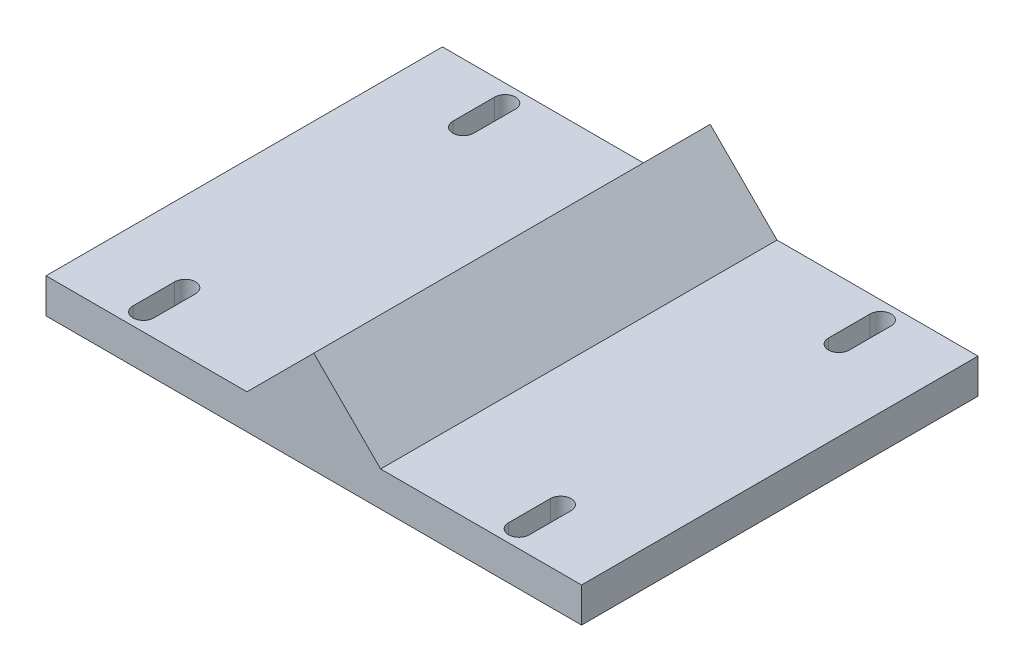
ISO-10303-21;
HEADER;
FILE_DESCRIPTION(('STEP AP214'),'2;1');
FILE_NAME('part.step','',(''),(''),'','','');
FILE_SCHEMA(('AUTOMOTIVE_DESIGN { 1 0 10303 214 1 1 1 1 }'));
ENDSEC;
DATA;
#1=APPLICATION_CONTEXT('core data for automotive mechanical design processes');
#2=APPLICATION_PROTOCOL_DEFINITION('international standard','automotive_design',2000,#1);
#3=PRODUCT_CONTEXT('',#1,'mechanical');
#4=PRODUCT('Part','Part','',(#3));
#5=PRODUCT_RELATED_PRODUCT_CATEGORY('part','',(#4));
#6=PRODUCT_DEFINITION_FORMATION('','',#4);
#7=PRODUCT_DEFINITION_CONTEXT('part definition',#1,'design');
#8=PRODUCT_DEFINITION('design','',#6,#7);
#9=PRODUCT_DEFINITION_SHAPE('','',#8);
#10=(LENGTH_UNIT() NAMED_UNIT(*) SI_UNIT(.MILLI.,.METRE.));
#11=(NAMED_UNIT(*) PLANE_ANGLE_UNIT() SI_UNIT($,.RADIAN.));
#12=(NAMED_UNIT(*) SI_UNIT($,.STERADIAN.) SOLID_ANGLE_UNIT());
#13=UNCERTAINTY_MEASURE_WITH_UNIT(LENGTH_MEASURE(1.E-05),#10,'distance_accuracy_value','');
#14=(GEOMETRIC_REPRESENTATION_CONTEXT(3) GLOBAL_UNCERTAINTY_ASSIGNED_CONTEXT((#13)) GLOBAL_UNIT_ASSIGNED_CONTEXT((#10,
#11,#12)) REPRESENTATION_CONTEXT('',''));
#15=CARTESIAN_POINT('',(0.,0.,0.));
#16=DIRECTION('',(0.,0.,1.));
#17=DIRECTION('',(1.,0.,0.));
#18=AXIS2_PLACEMENT_3D('',#15,#16,#17);
#19=CARTESIAN_POINT('',(7.53999999999993,-7.54,57.));
#20=DIRECTION('',(0.707106781186551,0.707106781186544,0.));
#21=DIRECTION('',(-0.707106781186544,0.707106781186551,0.));
#22=AXIS2_PLACEMENT_3D('',#19,#20,#21);
#23=PLANE('',#22);
#24=DIRECTION('',(0.,0.,-1.));
#25=VECTOR('',#24,1.);
#26=CARTESIAN_POINT('',(7.53999999999993,-7.54,57.));
#27=LINE('',#26,#25);
#28=CARTESIAN_POINT('',(7.53999999999993,-7.54,42.7));
#29=VERTEX_POINT('',#28);
#30=CARTESIAN_POINT('',(7.53999999999993,-7.54,0.));
#31=VERTEX_POINT('',#30);
#32=EDGE_CURVE('E367',#29,#31,#27,.T.);
#33=ORIENTED_EDGE('',*,*,#32,.F.);
#34=DIRECTION('',(-0.707106781186544,0.707106781186551,0.));
#35=VECTOR('',#34,1.);
#36=CARTESIAN_POINT('',(0.,0.,42.7));
#37=LINE('',#36,#35);
#38=CARTESIAN_POINT('',(0.,0.,42.7));
#39=VERTEX_POINT('',#38);
#40=EDGE_CURVE('E298',#29,#39,#37,.T.);
#41=ORIENTED_EDGE('',*,*,#40,.T.);
#42=DIRECTION('',(0.,0.,-1.));
#43=VECTOR('',#42,1.);
#44=CARTESIAN_POINT('',(0.,0.,57.));
#45=LINE('',#44,#43);
#46=CARTESIAN_POINT('',(0.,0.,0.));
#47=VERTEX_POINT('',#46);
#48=EDGE_CURVE('E321',#39,#47,#45,.T.);
#49=ORIENTED_EDGE('',*,*,#48,.T.);
#50=DIRECTION('',(0.707106781186544,-0.707106781186551,0.));
#51=VECTOR('',#50,1.);
#52=CARTESIAN_POINT('',(7.53999999999993,-7.54,0.));
#53=LINE('',#52,#51);
#54=EDGE_CURVE('E304',#47,#31,#53,.T.);
#55=ORIENTED_EDGE('',*,*,#54,.T.);
#56=EDGE_LOOP('',(#33,#41,#49,#55));
#57=FACE_BOUND('',#56,.T.);
#58=ADVANCED_FACE('F37',(#57),#23,.F.);
#59=CARTESIAN_POINT('',(38.4999999999999,-2.54,57.));
#60=DIRECTION('',(-1.,0.,0.));
#61=DIRECTION('',(0.,-1.,0.));
#62=AXIS2_PLACEMENT_3D('',#59,#60,#61);
#63=PLANE('',#62);
#64=DIRECTION('',(0.,1.,0.));
#65=VECTOR('',#64,1.);
#66=CARTESIAN_POINT('',(38.4999999999999,-2.54,0.));
#67=LINE('',#66,#65);
#68=CARTESIAN_POINT('',(38.4999999999999,-7.54,0.));
#69=VERTEX_POINT('',#68);
#70=CARTESIAN_POINT('',(38.4999999999999,-2.54,0.));
#71=VERTEX_POINT('',#70);
#72=EDGE_CURVE('E326',#69,#71,#67,.T.);
#73=ORIENTED_EDGE('',*,*,#72,.T.);
#74=DIRECTION('',(0.,0.,-1.));
#75=VECTOR('',#74,1.);
#76=CARTESIAN_POINT('',(38.4999999999999,-2.54,57.));
#77=LINE('',#76,#75);
#78=CARTESIAN_POINT('',(38.4999999999999,-2.54,57.));
#79=VERTEX_POINT('',#78);
#80=EDGE_CURVE('E361',#79,#71,#77,.T.);
#81=ORIENTED_EDGE('',*,*,#80,.F.);
#82=DIRECTION('',(0.,1.,0.));
#83=VECTOR('',#82,1.);
#84=CARTESIAN_POINT('',(38.4999999999999,-2.54,57.));
#85=LINE('',#84,#83);
#86=CARTESIAN_POINT('',(38.4999999999999,-7.54,57.));
#87=VERTEX_POINT('',#86);
#88=EDGE_CURVE('E307',#87,#79,#85,.T.);
#89=ORIENTED_EDGE('',*,*,#88,.F.);
#90=DIRECTION('',(0.,0.,-1.));
#91=VECTOR('',#90,1.);
#92=CARTESIAN_POINT('',(38.4999999999999,-7.54,57.));
#93=LINE('',#92,#91);
#94=EDGE_CURVE('E364',#87,#69,#93,.T.);
#95=ORIENTED_EDGE('',*,*,#94,.T.);
#96=EDGE_LOOP('',(#73,#81,#89,#95));
#97=FACE_BOUND('',#96,.T.);
#98=ADVANCED_FACE('F427',(#97),#63,.F.);
#99=CARTESIAN_POINT('',(9.61106781186541,-2.54,57.));
#100=DIRECTION('',(0.,-1.,0.));
#101=DIRECTION('',(0.,0.,-1.));
#102=AXIS2_PLACEMENT_3D('',#99,#100,#101);
#103=PLANE('',#102);
#104=DIRECTION('',(0.,0.,1.));
#105=VECTOR('',#104,1.);
#106=CARTESIAN_POINT('',(25.4996846506127,-2.54,48.5));
#107=LINE('',#106,#105);
#108=CARTESIAN_POINT('',(25.4996846506127,-2.54,48.5));
#109=VERTEX_POINT('',#108);
#110=CARTESIAN_POINT('',(25.4996846506127,-2.54,54.5));
#111=VERTEX_POINT('',#110);
#112=EDGE_CURVE('E274',#109,#111,#107,.T.);
#113=ORIENTED_EDGE('',*,*,#112,.F.);
#114=CARTESIAN_POINT('',(26.9999999999999,-2.54,48.5));
#115=DIRECTION('',(0.,1.,0.));
#116=DIRECTION('',(0.,0.,1.));
#117=AXIS2_PLACEMENT_3D('',#114,#115,#116);
#118=CIRCLE('',#117,1.50031534938726);
#119=CARTESIAN_POINT('',(28.5003153493872,-2.54,48.5));
#120=VERTEX_POINT('',#119);
#121=EDGE_CURVE('E51',#120,#109,#118,.T.);
#122=ORIENTED_EDGE('',*,*,#121,.F.);
#123=DIRECTION('',(0.,0.,1.));
#124=VECTOR('',#123,1.);
#125=CARTESIAN_POINT('',(28.5003153493872,-2.54,48.5));
#126=LINE('',#125,#124);
#127=CARTESIAN_POINT('',(28.5003153493872,-2.54,54.5));
#128=VERTEX_POINT('',#127);
#129=EDGE_CURVE('E262',#120,#128,#126,.T.);
#130=ORIENTED_EDGE('',*,*,#129,.T.);
#131=CARTESIAN_POINT('',(26.9999999999999,-2.54,54.5));
#132=DIRECTION('',(0.,1.,0.));
#133=DIRECTION('',(0.,0.,1.));
#134=AXIS2_PLACEMENT_3D('',#131,#132,#133);
#135=CIRCLE('',#134,1.50031534938726);
#136=EDGE_CURVE('E271',#111,#128,#135,.T.);
#137=ORIENTED_EDGE('',*,*,#136,.F.);
#138=EDGE_LOOP('',(#113,#122,#130,#137));
#139=FACE_BOUND('',#138,.T.);
#140=CARTESIAN_POINT('',(26.9999999999999,-2.54,8.5));
#141=DIRECTION('',(0.,1.,0.));
#142=DIRECTION('',(0.,0.,1.));
#143=AXIS2_PLACEMENT_3D('',#140,#141,#142);
#144=CIRCLE('',#143,1.50031534938727);
#145=CARTESIAN_POINT('',(25.4996846506127,-2.54,8.5));
#146=VERTEX_POINT('',#145);
#147=CARTESIAN_POINT('',(28.5003153493872,-2.54,8.5));
#148=VERTEX_POINT('',#147);
#149=EDGE_CURVE('E233',#146,#148,#144,.T.);
#150=ORIENTED_EDGE('',*,*,#149,.F.);
#151=DIRECTION('',(0.,0.,1.));
#152=VECTOR('',#151,1.);
#153=CARTESIAN_POINT('',(25.4996846506127,-2.54,0.));
#154=LINE('',#153,#152);
#155=CARTESIAN_POINT('',(25.4996846506127,-2.54,2.5));
#156=VERTEX_POINT('',#155);
#157=EDGE_CURVE('E59',#156,#146,#154,.T.);
#158=ORIENTED_EDGE('',*,*,#157,.F.);
#159=CARTESIAN_POINT('',(26.9999999999999,-2.54,2.5));
#160=DIRECTION('',(0.,1.,0.));
#161=DIRECTION('',(0.,0.,1.));
#162=AXIS2_PLACEMENT_3D('',#159,#160,#161);
#163=CIRCLE('',#162,1.50031534938727);
#164=CARTESIAN_POINT('',(28.5003153493872,-2.54,2.5));
#165=VERTEX_POINT('',#164);
#166=EDGE_CURVE('E220',#165,#156,#163,.T.);
#167=ORIENTED_EDGE('',*,*,#166,.F.);
#168=DIRECTION('',(0.,0.,1.));
#169=VECTOR('',#168,1.);
#170=CARTESIAN_POINT('',(28.5003153493872,-2.54,0.));
#171=LINE('',#170,#169);
#172=EDGE_CURVE('E226',#165,#148,#171,.T.);
#173=ORIENTED_EDGE('',*,*,#172,.T.);
#174=EDGE_LOOP('',(#150,#158,#167,#173));
#175=FACE_BOUND('',#174,.T.);
#176=DIRECTION('',(-1.,0.,0.));
#177=VECTOR('',#176,1.);
#178=CARTESIAN_POINT('',(9.61106781186541,-2.54,0.));
#179=LINE('',#178,#177);
#180=CARTESIAN_POINT('',(9.61106781186541,-2.54,0.));
#181=VERTEX_POINT('',#180);
#182=EDGE_CURVE('E328',#71,#181,#179,.T.);
#183=ORIENTED_EDGE('',*,*,#182,.T.);
#184=DIRECTION('',(0.,0.,-1.));
#185=VECTOR('',#184,1.);
#186=CARTESIAN_POINT('',(9.61106781186541,-2.54,57.));
#187=LINE('',#186,#185);
#188=CARTESIAN_POINT('',(9.61106781186541,-2.54,57.));
#189=VERTEX_POINT('',#188);
#190=EDGE_CURVE('E358',#189,#181,#187,.T.);
#191=ORIENTED_EDGE('',*,*,#190,.F.);
#192=DIRECTION('',(-1.,0.,0.));
#193=VECTOR('',#192,1.);
#194=CARTESIAN_POINT('',(9.61106781186541,-2.54,57.));
#195=LINE('',#194,#193);
#196=EDGE_CURVE('E310',#79,#189,#195,.T.);
#197=ORIENTED_EDGE('',*,*,#196,.F.);
#198=ORIENTED_EDGE('',*,*,#80,.T.);
#199=EDGE_LOOP('',(#183,#191,#197,#198));
#200=FACE_BOUND('',#199,.T.);
#201=ADVANCED_FACE('F230',(#139,#175,#200),#103,.F.);
#202=CARTESIAN_POINT('',(0.,7.07106781186549,57.));
#203=DIRECTION('',(-0.707106781186551,-0.707106781186544,0.));
#204=DIRECTION('',(0.707106781186544,-0.707106781186551,0.));
#205=AXIS2_PLACEMENT_3D('',#202,#203,#204);
#206=PLANE('',#205);
#207=DIRECTION('',(-0.707106781186544,0.707106781186551,0.));
#208=VECTOR('',#207,1.);
#209=CARTESIAN_POINT('',(0.,7.07106781186549,0.));
#210=LINE('',#209,#208);
#211=CARTESIAN_POINT('',(0.,7.07106781186549,0.));
#212=VERTEX_POINT('',#211);
#213=EDGE_CURVE('E330',#181,#212,#210,.T.);
#214=ORIENTED_EDGE('',*,*,#213,.T.);
#215=DIRECTION('',(0.,0.,-1.));
#216=VECTOR('',#215,1.);
#217=CARTESIAN_POINT('',(0.,7.07106781186549,57.));
#218=LINE('',#217,#216);
#219=CARTESIAN_POINT('',(0.,7.07106781186549,57.));
#220=VERTEX_POINT('',#219);
#221=EDGE_CURVE('E355',#220,#212,#218,.T.);
#222=ORIENTED_EDGE('',*,*,#221,.F.);
#223=DIRECTION('',(-0.707106781186544,0.707106781186551,0.));
#224=VECTOR('',#223,1.);
#225=CARTESIAN_POINT('',(0.,7.07106781186549,57.));
#226=LINE('',#225,#224);
#227=EDGE_CURVE('E312',#189,#220,#226,.T.);
#228=ORIENTED_EDGE('',*,*,#227,.F.);
#229=ORIENTED_EDGE('',*,*,#190,.T.);
#230=EDGE_LOOP('',(#214,#222,#228,#229));
#231=FACE_BOUND('',#230,.T.);
#232=ADVANCED_FACE('F426',(#231),#206,.F.);
#233=CARTESIAN_POINT('',(-9.6110678118655,-2.54000000000001,57.));
#234=DIRECTION('',(0.707106781186546,-0.707106781186549,0.));
#235=DIRECTION('',(0.707106781186549,0.707106781186546,0.));
#236=AXIS2_PLACEMENT_3D('',#233,#234,#235);
#237=PLANE('',#236);
#238=DIRECTION('',(-0.707106781186549,-0.707106781186546,0.));
#239=VECTOR('',#238,1.);
#240=CARTESIAN_POINT('',(-9.6110678118655,-2.54000000000001,0.));
#241=LINE('',#240,#239);
#242=CARTESIAN_POINT('',(-9.6110678118655,-2.54000000000001,0.));
#243=VERTEX_POINT('',#242);
#244=EDGE_CURVE('E332',#212,#243,#241,.T.);
#245=ORIENTED_EDGE('',*,*,#244,.T.);
#246=DIRECTION('',(0.,0.,-1.));
#247=VECTOR('',#246,1.);
#248=CARTESIAN_POINT('',(-9.6110678118655,-2.54000000000001,57.));
#249=LINE('',#248,#247);
#250=CARTESIAN_POINT('',(-9.6110678118655,-2.54000000000001,57.));
#251=VERTEX_POINT('',#250);
#252=EDGE_CURVE('E352',#251,#243,#249,.T.);
#253=ORIENTED_EDGE('',*,*,#252,.F.);
#254=DIRECTION('',(-0.707106781186549,-0.707106781186546,0.));
#255=VECTOR('',#254,1.);
#256=CARTESIAN_POINT('',(-9.6110678118655,-2.54000000000001,57.));
#257=LINE('',#256,#255);
#258=EDGE_CURVE('E314',#220,#251,#257,.T.);
#259=ORIENTED_EDGE('',*,*,#258,.F.);
#260=ORIENTED_EDGE('',*,*,#221,.T.);
#261=EDGE_LOOP('',(#245,#253,#259,#260));
#262=FACE_BOUND('',#261,.T.);
#263=ADVANCED_FACE('F434',(#262),#237,.F.);
#264=CARTESIAN_POINT('',(-38.5,-2.54,57.));
#265=DIRECTION('',(0.,-1.,0.));
#266=DIRECTION('',(1.,0.,0.));
#267=AXIS2_PLACEMENT_3D('',#264,#265,#266);
#268=PLANE('',#267);
#269=CARTESIAN_POINT('',(-27.,-2.54,8.5));
#270=DIRECTION('',(0.,1.,0.));
#271=DIRECTION('',(0.,0.,1.));
#272=AXIS2_PLACEMENT_3D('',#269,#270,#271);
#273=CIRCLE('',#272,1.50031534938726);
#274=CARTESIAN_POINT('',(-28.5003153493873,-2.54000000000001,8.5));
#275=VERTEX_POINT('',#274);
#276=CARTESIAN_POINT('',(-25.4996846506128,-2.54,8.5));
#277=VERTEX_POINT('',#276);
#278=EDGE_CURVE('E256',#275,#277,#273,.T.);
#279=ORIENTED_EDGE('',*,*,#278,.F.);
#280=DIRECTION('',(0.,0.,1.));
#281=VECTOR('',#280,1.);
#282=CARTESIAN_POINT('',(-28.5003153493873,-2.54,0.));
#283=LINE('',#282,#281);
#284=CARTESIAN_POINT('',(-28.5003153493873,-2.54,2.5));
#285=VERTEX_POINT('',#284);
#286=EDGE_CURVE('E217',#285,#275,#283,.T.);
#287=ORIENTED_EDGE('',*,*,#286,.F.);
#288=CARTESIAN_POINT('',(-27.,-2.54,2.5));
#289=DIRECTION('',(0.,1.,0.));
#290=DIRECTION('',(0.,0.,1.));
#291=AXIS2_PLACEMENT_3D('',#288,#289,#290);
#292=CIRCLE('',#291,1.50031534938726);
#293=CARTESIAN_POINT('',(-25.4996846506128,-2.54,2.5));
#294=VERTEX_POINT('',#293);
#295=EDGE_CURVE('E244',#294,#285,#292,.T.);
#296=ORIENTED_EDGE('',*,*,#295,.F.);
#297=DIRECTION('',(0.,0.,1.));
#298=VECTOR('',#297,1.);
#299=CARTESIAN_POINT('',(-25.4996846506128,-2.54,0.));
#300=LINE('',#299,#298);
#301=EDGE_CURVE('E253',#294,#277,#300,.T.);
#302=ORIENTED_EDGE('',*,*,#301,.T.);
#303=EDGE_LOOP('',(#279,#287,#296,#302));
#304=FACE_BOUND('',#303,.T.);
#305=CARTESIAN_POINT('',(-27.,-2.54,54.5));
#306=DIRECTION('',(0.,1.,0.));
#307=DIRECTION('',(0.,0.,1.));
#308=AXIS2_PLACEMENT_3D('',#305,#306,#307);
#309=CIRCLE('',#308,1.50031534938726);
#310=CARTESIAN_POINT('',(-28.5003153493873,-2.54000000000001,54.5));
#311=VERTEX_POINT('',#310);
#312=CARTESIAN_POINT('',(-25.4996846506128,-2.54,54.5));
#313=VERTEX_POINT('',#312);
#314=EDGE_CURVE('E236',#311,#313,#309,.T.);
#315=ORIENTED_EDGE('',*,*,#314,.F.);
#316=DIRECTION('',(0.,0.,1.));
#317=VECTOR('',#316,1.);
#318=CARTESIAN_POINT('',(-28.5003153493873,-2.54,0.));
#319=LINE('',#318,#317);
#320=CARTESIAN_POINT('',(-28.5003153493873,-2.54,48.5));
#321=VERTEX_POINT('',#320);
#322=EDGE_CURVE('E234',#321,#311,#319,.T.);
#323=ORIENTED_EDGE('',*,*,#322,.F.);
#324=CARTESIAN_POINT('',(-27.,-2.54,48.5));
#325=DIRECTION('',(0.,1.,0.));
#326=DIRECTION('',(0.,0.,1.));
#327=AXIS2_PLACEMENT_3D('',#324,#325,#326);
#328=CIRCLE('',#327,1.50031534938726);
#329=CARTESIAN_POINT('',(-25.4996846506128,-2.54,48.5));
#330=VERTEX_POINT('',#329);
#331=EDGE_CURVE('E283',#330,#321,#328,.T.);
#332=ORIENTED_EDGE('',*,*,#331,.F.);
#333=DIRECTION('',(0.,0.,1.));
#334=VECTOR('',#333,1.);
#335=CARTESIAN_POINT('',(-25.4996846506128,-2.54,0.));
#336=LINE('',#335,#334);
#337=EDGE_CURVE('E280',#330,#313,#336,.T.);
#338=ORIENTED_EDGE('',*,*,#337,.T.);
#339=EDGE_LOOP('',(#315,#323,#332,#338));
#340=FACE_BOUND('',#339,.T.);
#341=DIRECTION('',(-1.,0.,0.));
#342=VECTOR('',#341,1.);
#343=CARTESIAN_POINT('',(-38.5,-2.54,0.));
#344=LINE('',#343,#342);
#345=CARTESIAN_POINT('',(-38.5,-2.54,0.));
#346=VERTEX_POINT('',#345);
#347=EDGE_CURVE('E334',#243,#346,#344,.T.);
#348=ORIENTED_EDGE('',*,*,#347,.T.);
#349=DIRECTION('',(0.,0.,-1.));
#350=VECTOR('',#349,1.);
#351=CARTESIAN_POINT('',(-38.5,-2.54,57.));
#352=LINE('',#351,#350);
#353=CARTESIAN_POINT('',(-38.5,-2.54,57.));
#354=VERTEX_POINT('',#353);
#355=EDGE_CURVE('E349',#354,#346,#352,.T.);
#356=ORIENTED_EDGE('',*,*,#355,.F.);
#357=DIRECTION('',(-1.,0.,0.));
#358=VECTOR('',#357,1.);
#359=CARTESIAN_POINT('',(-38.5,-2.54,57.));
#360=LINE('',#359,#358);
#361=EDGE_CURVE('E316',#251,#354,#360,.T.);
#362=ORIENTED_EDGE('',*,*,#361,.F.);
#363=ORIENTED_EDGE('',*,*,#252,.T.);
#364=EDGE_LOOP('',(#348,#356,#362,#363));
#365=FACE_BOUND('',#364,.T.);
#366=ADVANCED_FACE('F496',(#304,#340,#365),#268,.F.);
#367=CARTESIAN_POINT('',(-38.5,-7.54,57.));
#368=DIRECTION('',(1.,0.,0.));
#369=DIRECTION('',(0.,1.,0.));
#370=AXIS2_PLACEMENT_3D('',#367,#368,#369);
#371=PLANE('',#370);
#372=DIRECTION('',(0.,-1.,0.));
#373=VECTOR('',#372,1.);
#374=CARTESIAN_POINT('',(-38.5,-7.54,0.));
#375=LINE('',#374,#373);
#376=CARTESIAN_POINT('',(-38.5,-7.54,0.));
#377=VERTEX_POINT('',#376);
#378=EDGE_CURVE('E336',#346,#377,#375,.T.);
#379=ORIENTED_EDGE('',*,*,#378,.T.);
#380=DIRECTION('',(0.,0.,-1.));
#381=VECTOR('',#380,1.);
#382=CARTESIAN_POINT('',(-38.5,-7.54,57.));
#383=LINE('',#382,#381);
#384=CARTESIAN_POINT('',(-38.5,-7.54,57.));
#385=VERTEX_POINT('',#384);
#386=EDGE_CURVE('E346',#385,#377,#383,.T.);
#387=ORIENTED_EDGE('',*,*,#386,.F.);
#388=DIRECTION('',(0.,-1.,0.));
#389=VECTOR('',#388,1.);
#390=CARTESIAN_POINT('',(-38.5,-7.54,57.));
#391=LINE('',#390,#389);
#392=EDGE_CURVE('E318',#354,#385,#391,.T.);
#393=ORIENTED_EDGE('',*,*,#392,.F.);
#394=ORIENTED_EDGE('',*,*,#355,.T.);
#395=EDGE_LOOP('',(#379,#387,#393,#394));
#396=FACE_BOUND('',#395,.T.);
#397=ADVANCED_FACE('F493',(#396),#371,.F.);
#398=CARTESIAN_POINT('',(-7.54000000000002,-7.54,57.));
#399=DIRECTION('',(0.,1.,0.));
#400=DIRECTION('',(-1.,0.,0.));
#401=AXIS2_PLACEMENT_3D('',#398,#399,#400);
#402=PLANE('',#401);
#403=DIRECTION('',(0.,0.,1.));
#404=VECTOR('',#403,1.);
#405=CARTESIAN_POINT('',(28.5003153493872,-7.54,57.));
#406=LINE('',#405,#404);
#407=CARTESIAN_POINT('',(28.5003153493872,-7.54,48.5));
#408=VERTEX_POINT('',#407);
#409=CARTESIAN_POINT('',(28.5003153493872,-7.54,54.5));
#410=VERTEX_POINT('',#409);
#411=EDGE_CURVE('E44',#408,#410,#406,.T.);
#412=ORIENTED_EDGE('',*,*,#411,.F.);
#413=CARTESIAN_POINT('',(26.9999999999999,-7.54,48.5));
#414=DIRECTION('',(0.,1.,0.));
#415=DIRECTION('',(-1.,0.,0.));
#416=AXIS2_PLACEMENT_3D('',#413,#414,#415);
#417=CIRCLE('',#416,1.50031534938726);
#418=CARTESIAN_POINT('',(25.4996846506127,-7.54,48.5));
#419=VERTEX_POINT('',#418);
#420=EDGE_CURVE('E11',#408,#419,#417,.T.);
#421=ORIENTED_EDGE('',*,*,#420,.T.);
#422=DIRECTION('',(0.,0.,1.));
#423=VECTOR('',#422,1.);
#424=CARTESIAN_POINT('',(25.4996846506127,-7.54,57.));
#425=LINE('',#424,#423);
#426=CARTESIAN_POINT('',(25.4996846506127,-7.54,54.5));
#427=VERTEX_POINT('',#426);
#428=EDGE_CURVE('E402',#419,#427,#425,.T.);
#429=ORIENTED_EDGE('',*,*,#428,.T.);
#430=CARTESIAN_POINT('',(26.9999999999999,-7.54,54.5));
#431=DIRECTION('',(0.,1.,0.));
#432=DIRECTION('',(-1.,0.,0.));
#433=AXIS2_PLACEMENT_3D('',#430,#431,#432);
#434=CIRCLE('',#433,1.50031534938726);
#435=EDGE_CURVE('E405',#427,#410,#434,.T.);
#436=ORIENTED_EDGE('',*,*,#435,.T.);
#437=EDGE_LOOP('',(#412,#421,#429,#436));
#438=FACE_BOUND('',#437,.T.);
#439=CARTESIAN_POINT('',(-27.,-7.54,2.5));
#440=DIRECTION('',(0.,1.,0.));
#441=DIRECTION('',(-1.,0.,0.));
#442=AXIS2_PLACEMENT_3D('',#439,#440,#441);
#443=CIRCLE('',#442,1.50031534938726);
#444=CARTESIAN_POINT('',(-25.4996846506128,-7.54,2.5));
#445=VERTEX_POINT('',#444);
#446=CARTESIAN_POINT('',(-28.5003153493873,-7.54,2.5));
#447=VERTEX_POINT('',#446);
#448=EDGE_CURVE('E396',#445,#447,#443,.T.);
#449=ORIENTED_EDGE('',*,*,#448,.T.);
#450=DIRECTION('',(0.,0.,1.));
#451=VECTOR('',#450,1.);
#452=CARTESIAN_POINT('',(-28.5003153493873,-7.54,57.));
#453=LINE('',#452,#451);
#454=CARTESIAN_POINT('',(-28.5003153493873,-7.54,8.5));
#455=VERTEX_POINT('',#454);
#456=EDGE_CURVE('E399',#447,#455,#453,.T.);
#457=ORIENTED_EDGE('',*,*,#456,.T.);
#458=CARTESIAN_POINT('',(-27.,-7.54,8.5));
#459=DIRECTION('',(0.,1.,0.));
#460=DIRECTION('',(-1.,0.,0.));
#461=AXIS2_PLACEMENT_3D('',#458,#459,#460);
#462=CIRCLE('',#461,1.50031534938726);
#463=CARTESIAN_POINT('',(-25.4996846506128,-7.54,8.5));
#464=VERTEX_POINT('',#463);
#465=EDGE_CURVE('E390',#455,#464,#462,.T.);
#466=ORIENTED_EDGE('',*,*,#465,.T.);
#467=DIRECTION('',(0.,0.,1.));
#468=VECTOR('',#467,1.);
#469=CARTESIAN_POINT('',(-25.4996846506127,-7.54,57.));
#470=LINE('',#469,#468);
#471=EDGE_CURVE('E393',#445,#464,#470,.T.);
#472=ORIENTED_EDGE('',*,*,#471,.F.);
#473=EDGE_LOOP('',(#449,#457,#466,#472));
#474=FACE_BOUND('',#473,.T.);
#475=CARTESIAN_POINT('',(26.9999999999999,-7.54,2.5));
#476=DIRECTION('',(0.,1.,0.));
#477=DIRECTION('',(-1.,0.,0.));
#478=AXIS2_PLACEMENT_3D('',#475,#476,#477);
#479=CIRCLE('',#478,1.50031534938727);
#480=CARTESIAN_POINT('',(28.5003153493872,-7.54,2.5));
#481=VERTEX_POINT('',#480);
#482=CARTESIAN_POINT('',(25.4996846506127,-7.54,2.5));
#483=VERTEX_POINT('',#482);
#484=EDGE_CURVE('E387',#481,#483,#479,.T.);
#485=ORIENTED_EDGE('',*,*,#484,.T.);
#486=DIRECTION('',(0.,0.,1.));
#487=VECTOR('',#486,1.);
#488=CARTESIAN_POINT('',(25.4996846506127,-7.54,57.));
#489=LINE('',#488,#487);
#490=CARTESIAN_POINT('',(25.4996846506127,-7.54,8.5));
#491=VERTEX_POINT('',#490);
#492=EDGE_CURVE('E213',#483,#491,#489,.T.);
#493=ORIENTED_EDGE('',*,*,#492,.T.);
#494=CARTESIAN_POINT('',(26.9999999999999,-7.54,8.5));
#495=DIRECTION('',(0.,1.,0.));
#496=DIRECTION('',(-1.,0.,0.));
#497=AXIS2_PLACEMENT_3D('',#494,#495,#496);
#498=CIRCLE('',#497,1.50031534938727);
#499=CARTESIAN_POINT('',(28.5003153493872,-7.54,8.5));
#500=VERTEX_POINT('',#499);
#501=EDGE_CURVE('E381',#491,#500,#498,.T.);
#502=ORIENTED_EDGE('',*,*,#501,.T.);
#503=DIRECTION('',(0.,0.,1.));
#504=VECTOR('',#503,1.);
#505=CARTESIAN_POINT('',(28.5003153493872,-7.54,57.));
#506=LINE('',#505,#504);
#507=EDGE_CURVE('E384',#481,#500,#506,.T.);
#508=ORIENTED_EDGE('',*,*,#507,.F.);
#509=EDGE_LOOP('',(#485,#493,#502,#508));
#510=FACE_BOUND('',#509,.T.);
#511=CARTESIAN_POINT('',(-27.,-7.54,48.5));
#512=DIRECTION('',(0.,1.,0.));
#513=DIRECTION('',(-1.,0.,0.));
#514=AXIS2_PLACEMENT_3D('',#511,#512,#513);
#515=CIRCLE('',#514,1.50031534938726);
#516=CARTESIAN_POINT('',(-25.4996846506128,-7.54,48.5));
#517=VERTEX_POINT('',#516);
#518=CARTESIAN_POINT('',(-28.5003153493873,-7.54,48.5));
#519=VERTEX_POINT('',#518);
#520=EDGE_CURVE('E375',#517,#519,#515,.T.);
#521=ORIENTED_EDGE('',*,*,#520,.T.);
#522=DIRECTION('',(0.,0.,1.));
#523=VECTOR('',#522,1.);
#524=CARTESIAN_POINT('',(-28.5003153493873,-7.54,57.));
#525=LINE('',#524,#523);
#526=CARTESIAN_POINT('',(-28.5003153493873,-7.54,54.5));
#527=VERTEX_POINT('',#526);
#528=EDGE_CURVE('E378',#519,#527,#525,.T.);
#529=ORIENTED_EDGE('',*,*,#528,.T.);
#530=CARTESIAN_POINT('',(-27.,-7.54,54.5));
#531=DIRECTION('',(0.,1.,0.));
#532=DIRECTION('',(-1.,0.,0.));
#533=AXIS2_PLACEMENT_3D('',#530,#531,#532);
#534=CIRCLE('',#533,1.50031534938726);
#535=CARTESIAN_POINT('',(-25.4996846506128,-7.54,54.5));
#536=VERTEX_POINT('',#535);
#537=EDGE_CURVE('E369',#527,#536,#534,.T.);
#538=ORIENTED_EDGE('',*,*,#537,.T.);
#539=DIRECTION('',(0.,0.,1.));
#540=VECTOR('',#539,1.);
#541=CARTESIAN_POINT('',(-25.4996846506128,-7.54,57.));
#542=LINE('',#541,#540);
#543=EDGE_CURVE('E372',#517,#536,#542,.T.);
#544=ORIENTED_EDGE('',*,*,#543,.F.);
#545=EDGE_LOOP('',(#521,#529,#538,#544));
#546=FACE_BOUND('',#545,.T.);
#547=DIRECTION('',(1.,0.,0.));
#548=VECTOR('',#547,1.);
#549=CARTESIAN_POINT('',(-7.54000000000002,-7.54,0.));
#550=LINE('',#549,#548);
#551=CARTESIAN_POINT('',(-7.54000000000002,-7.54,0.));
#552=VERTEX_POINT('',#551);
#553=EDGE_CURVE('E338',#377,#552,#550,.T.);
#554=ORIENTED_EDGE('',*,*,#553,.T.);
#555=DIRECTION('',(0.,0.,-1.));
#556=VECTOR('',#555,1.);
#557=CARTESIAN_POINT('',(-7.54000000000002,-7.54,57.));
#558=LINE('',#557,#556);
#559=CARTESIAN_POINT('',(-7.54000000000002,-7.54,42.7));
#560=VERTEX_POINT('',#559);
#561=EDGE_CURVE('E344',#560,#552,#558,.T.);
#562=ORIENTED_EDGE('',*,*,#561,.F.);
#563=DIRECTION('',(1.,0.,0.));
#564=VECTOR('',#563,1.);
#565=CARTESIAN_POINT('',(7.53999999999993,-7.54,42.7));
#566=LINE('',#565,#564);
#567=EDGE_CURVE('E289',#560,#29,#566,.T.);
#568=ORIENTED_EDGE('',*,*,#567,.T.);
#569=ORIENTED_EDGE('',*,*,#32,.T.);
#570=DIRECTION('',(1.,0.,0.));
#571=VECTOR('',#570,1.);
#572=CARTESIAN_POINT('',(38.4999999999999,-7.54,0.));
#573=LINE('',#572,#571);
#574=EDGE_CURVE('E324',#31,#69,#573,.T.);
#575=ORIENTED_EDGE('',*,*,#574,.T.);
#576=ORIENTED_EDGE('',*,*,#94,.F.);
#577=DIRECTION('',(1.,0.,0.));
#578=VECTOR('',#577,1.);
#579=CARTESIAN_POINT('',(38.4999999999999,-7.54,57.));
#580=LINE('',#579,#578);
#581=EDGE_CURVE('E305',#385,#87,#580,.T.);
#582=ORIENTED_EDGE('',*,*,#581,.F.);
#583=ORIENTED_EDGE('',*,*,#386,.T.);
#584=EDGE_LOOP('',(#554,#562,#568,#569,#575,#576,#582,#583));
#585=FACE_BOUND('',#584,.T.);
#586=ADVANCED_FACE('F418',(#438,#474,#510,#546,#585),#402,.F.);
#587=CARTESIAN_POINT('',(0.,0.,57.));
#588=DIRECTION('',(-0.707106781186546,0.707106781186549,0.));
#589=DIRECTION('',(-0.707106781186549,-0.707106781186546,0.));
#590=AXIS2_PLACEMENT_3D('',#587,#588,#589);
#591=PLANE('',#590);
#592=ORIENTED_EDGE('',*,*,#48,.F.);
#593=DIRECTION('',(-0.707106781186549,-0.707106781186547,0.));
#594=VECTOR('',#593,1.);
#595=CARTESIAN_POINT('',(-7.54000000000002,-7.54,42.7));
#596=LINE('',#595,#594);
#597=EDGE_CURVE('E301',#39,#560,#596,.T.);
#598=ORIENTED_EDGE('',*,*,#597,.T.);
#599=ORIENTED_EDGE('',*,*,#561,.T.);
#600=DIRECTION('',(0.707106781186549,0.707106781186547,0.));
#601=VECTOR('',#600,1.);
#602=CARTESIAN_POINT('',(0.,0.,0.));
#603=LINE('',#602,#601);
#604=EDGE_CURVE('E308',#552,#47,#603,.T.);
#605=ORIENTED_EDGE('',*,*,#604,.T.);
#606=EDGE_LOOP('',(#592,#598,#599,#605));
#607=FACE_BOUND('',#606,.T.);
#608=ADVANCED_FACE('F473',(#607),#591,.F.);
#609=CARTESIAN_POINT('',(0.,0.,57.));
#610=DIRECTION('',(0.,0.,1.));
#611=DIRECTION('',(1.,0.,0.));
#612=AXIS2_PLACEMENT_3D('',#609,#610,#611);
#613=PLANE('',#612);
#614=ORIENTED_EDGE('',*,*,#392,.T.);
#615=ORIENTED_EDGE('',*,*,#581,.T.);
#616=ORIENTED_EDGE('',*,*,#88,.T.);
#617=ORIENTED_EDGE('',*,*,#196,.T.);
#618=ORIENTED_EDGE('',*,*,#227,.T.);
#619=ORIENTED_EDGE('',*,*,#258,.T.);
#620=ORIENTED_EDGE('',*,*,#361,.T.);
#621=EDGE_LOOP('',(#614,#615,#616,#617,#618,#619,#620));
#622=FACE_BOUND('',#621,.T.);
#623=ADVANCED_FACE('F464',(#622),#613,.T.);
#624=CARTESIAN_POINT('',(0.,0.,0.));
#625=DIRECTION('',(0.,0.,1.));
#626=DIRECTION('',(1.,0.,0.));
#627=AXIS2_PLACEMENT_3D('',#624,#625,#626);
#628=PLANE('',#627);
#629=ORIENTED_EDGE('',*,*,#54,.F.);
#630=ORIENTED_EDGE('',*,*,#604,.F.);
#631=ORIENTED_EDGE('',*,*,#553,.F.);
#632=ORIENTED_EDGE('',*,*,#378,.F.);
#633=ORIENTED_EDGE('',*,*,#347,.F.);
#634=ORIENTED_EDGE('',*,*,#244,.F.);
#635=ORIENTED_EDGE('',*,*,#213,.F.);
#636=ORIENTED_EDGE('',*,*,#182,.F.);
#637=ORIENTED_EDGE('',*,*,#72,.F.);
#638=ORIENTED_EDGE('',*,*,#574,.F.);
#639=EDGE_LOOP('',(#629,#630,#631,#632,#633,#634,#635,#636,#637,#638));
#640=FACE_BOUND('',#639,.T.);
#641=ADVANCED_FACE('F454',(#640),#628,.F.);
#642=CARTESIAN_POINT('',(0.,0.,42.7));
#643=DIRECTION('',(0.,0.,-1.));
#644=DIRECTION('',(-1.,0.,0.));
#645=AXIS2_PLACEMENT_3D('',#642,#643,#644);
#646=PLANE('',#645);
#647=ORIENTED_EDGE('',*,*,#567,.F.);
#648=ORIENTED_EDGE('',*,*,#597,.F.);
#649=ORIENTED_EDGE('',*,*,#40,.F.);
#650=EDGE_LOOP('',(#647,#648,#649));
#651=FACE_BOUND('',#650,.T.);
#652=ADVANCED_FACE('F475',(#651),#646,.T.);
#653=CARTESIAN_POINT('',(-28.5003153493873,-12.54,0.));
#654=DIRECTION('',(-1.,0.,0.));
#655=DIRECTION('',(0.,0.,1.));
#656=AXIS2_PLACEMENT_3D('',#653,#654,#655);
#657=PLANE('',#656);
#658=DIRECTION('',(0.,1.,0.));
#659=VECTOR('',#658,1.);
#660=CARTESIAN_POINT('',(-28.5003153493873,-12.54,48.5));
#661=LINE('',#660,#659);
#662=EDGE_CURVE('E287',#519,#321,#661,.T.);
#663=ORIENTED_EDGE('',*,*,#662,.T.);
#664=ORIENTED_EDGE('',*,*,#322,.T.);
#665=DIRECTION('',(0.,1.,0.));
#666=VECTOR('',#665,1.);
#667=CARTESIAN_POINT('',(-28.5003153493873,-12.54,54.5));
#668=LINE('',#667,#666);
#669=EDGE_CURVE('E286',#527,#311,#668,.T.);
#670=ORIENTED_EDGE('',*,*,#669,.F.);
#671=ORIENTED_EDGE('',*,*,#528,.F.);
#672=EDGE_LOOP('',(#663,#664,#670,#671));
#673=FACE_BOUND('',#672,.T.);
#674=ADVANCED_FACE('F477',(#673),#657,.F.);
#675=CARTESIAN_POINT('',(-27.,-12.54,48.5));
#676=DIRECTION('',(0.,1.,0.));
#677=DIRECTION('',(0.,0.,1.));
#678=AXIS2_PLACEMENT_3D('',#675,#676,#677);
#679=CYLINDRICAL_SURFACE('',#678,1.50031534938726);
#680=DIRECTION('',(0.,1.,0.));
#681=VECTOR('',#680,1.);
#682=CARTESIAN_POINT('',(-25.4996846506128,-12.54,48.5));
#683=LINE('',#682,#681);
#684=EDGE_CURVE('E290',#517,#330,#683,.T.);
#685=ORIENTED_EDGE('',*,*,#684,.T.);
#686=ORIENTED_EDGE('',*,*,#331,.T.);
#687=ORIENTED_EDGE('',*,*,#662,.F.);
#688=ORIENTED_EDGE('',*,*,#520,.F.);
#689=EDGE_LOOP('',(#685,#686,#687,#688));
#690=FACE_BOUND('',#689,.T.);
#691=ADVANCED_FACE('F482',(#690),#679,.F.);
#692=CARTESIAN_POINT('',(-25.4996846506128,-12.54,0.));
#693=DIRECTION('',(-1.,0.,0.));
#694=DIRECTION('',(0.,0.,1.));
#695=AXIS2_PLACEMENT_3D('',#692,#693,#694);
#696=PLANE('',#695);
#697=ORIENTED_EDGE('',*,*,#543,.T.);
#698=DIRECTION('',(0.,1.,0.));
#699=VECTOR('',#698,1.);
#700=CARTESIAN_POINT('',(-25.4996846506128,-12.54,54.5));
#701=LINE('',#700,#699);
#702=EDGE_CURVE('E292',#536,#313,#701,.T.);
#703=ORIENTED_EDGE('',*,*,#702,.T.);
#704=ORIENTED_EDGE('',*,*,#337,.F.);
#705=ORIENTED_EDGE('',*,*,#684,.F.);
#706=EDGE_LOOP('',(#697,#703,#704,#705));
#707=FACE_BOUND('',#706,.T.);
#708=ADVANCED_FACE('F570',(#707),#696,.T.);
#709=CARTESIAN_POINT('',(-27.,-12.54,54.5));
#710=DIRECTION('',(0.,1.,0.));
#711=DIRECTION('',(0.,0.,1.));
#712=AXIS2_PLACEMENT_3D('',#709,#710,#711);
#713=CYLINDRICAL_SURFACE('',#712,1.50031534938726);
#714=ORIENTED_EDGE('',*,*,#669,.T.);
#715=ORIENTED_EDGE('',*,*,#314,.T.);
#716=ORIENTED_EDGE('',*,*,#702,.F.);
#717=ORIENTED_EDGE('',*,*,#537,.F.);
#718=EDGE_LOOP('',(#714,#715,#716,#717));
#719=FACE_BOUND('',#718,.T.);
#720=ADVANCED_FACE('F581',(#719),#713,.F.);
#721=CARTESIAN_POINT('',(25.4996846506127,-12.54,0.));
#722=DIRECTION('',(-1.,0.,0.));
#723=DIRECTION('',(0.,0.,1.));
#724=AXIS2_PLACEMENT_3D('',#721,#722,#723);
#725=PLANE('',#724);
#726=DIRECTION('',(0.,1.,0.));
#727=VECTOR('',#726,1.);
#728=CARTESIAN_POINT('',(25.4996846506127,-12.54,2.5));
#729=LINE('',#728,#727);
#730=EDGE_CURVE('E209',#483,#156,#729,.T.);
#731=ORIENTED_EDGE('',*,*,#730,.T.);
#732=ORIENTED_EDGE('',*,*,#157,.T.);
#733=DIRECTION('',(0.,1.,0.));
#734=VECTOR('',#733,1.);
#735=CARTESIAN_POINT('',(25.4996846506127,-12.54,8.5));
#736=LINE('',#735,#734);
#737=EDGE_CURVE('E227',#491,#146,#736,.T.);
#738=ORIENTED_EDGE('',*,*,#737,.F.);
#739=ORIENTED_EDGE('',*,*,#492,.F.);
#740=EDGE_LOOP('',(#731,#732,#738,#739));
#741=FACE_BOUND('',#740,.T.);
#742=ADVANCED_FACE('F211',(#741),#725,.F.);
#743=CARTESIAN_POINT('',(26.9999999999999,-12.54,2.5));
#744=DIRECTION('',(0.,1.,0.));
#745=DIRECTION('',(0.,0.,1.));
#746=AXIS2_PLACEMENT_3D('',#743,#744,#745);
#747=CYLINDRICAL_SURFACE('',#746,1.50031534938727);
#748=DIRECTION('',(0.,1.,0.));
#749=VECTOR('',#748,1.);
#750=CARTESIAN_POINT('',(28.5003153493872,-12.54,2.5));
#751=LINE('',#750,#749);
#752=EDGE_CURVE('E216',#481,#165,#751,.T.);
#753=ORIENTED_EDGE('',*,*,#752,.T.);
#754=ORIENTED_EDGE('',*,*,#166,.T.);
#755=ORIENTED_EDGE('',*,*,#730,.F.);
#756=ORIENTED_EDGE('',*,*,#484,.F.);
#757=EDGE_LOOP('',(#753,#754,#755,#756));
#758=FACE_BOUND('',#757,.T.);
#759=ADVANCED_FACE('F221',(#758),#747,.F.);
#760=CARTESIAN_POINT('',(28.5003153493872,-12.54,0.));
#761=DIRECTION('',(-1.,0.,0.));
#762=DIRECTION('',(0.,0.,1.));
#763=AXIS2_PLACEMENT_3D('',#760,#761,#762);
#764=PLANE('',#763);
#765=ORIENTED_EDGE('',*,*,#507,.T.);
#766=DIRECTION('',(0.,1.,0.));
#767=VECTOR('',#766,1.);
#768=CARTESIAN_POINT('',(28.5003153493872,-12.54,8.5));
#769=LINE('',#768,#767);
#770=EDGE_CURVE('E750',#500,#148,#769,.T.);
#771=ORIENTED_EDGE('',*,*,#770,.T.);
#772=ORIENTED_EDGE('',*,*,#172,.F.);
#773=ORIENTED_EDGE('',*,*,#752,.F.);
#774=EDGE_LOOP('',(#765,#771,#772,#773));
#775=FACE_BOUND('',#774,.T.);
#776=ADVANCED_FACE('F610',(#775),#764,.T.);
#777=CARTESIAN_POINT('',(26.9999999999999,-12.54,8.5));
#778=DIRECTION('',(0.,1.,0.));
#779=DIRECTION('',(0.,0.,1.));
#780=AXIS2_PLACEMENT_3D('',#777,#778,#779);
#781=CYLINDRICAL_SURFACE('',#780,1.50031534938727);
#782=ORIENTED_EDGE('',*,*,#737,.T.);
#783=ORIENTED_EDGE('',*,*,#149,.T.);
#784=ORIENTED_EDGE('',*,*,#770,.F.);
#785=ORIENTED_EDGE('',*,*,#501,.F.);
#786=EDGE_LOOP('',(#782,#783,#784,#785));
#787=FACE_BOUND('',#786,.T.);
#788=ADVANCED_FACE('F620',(#787),#781,.F.);
#789=CARTESIAN_POINT('',(-28.5003153493873,-12.54,0.));
#790=DIRECTION('',(-1.,0.,0.));
#791=DIRECTION('',(0.,0.,1.));
#792=AXIS2_PLACEMENT_3D('',#789,#790,#791);
#793=PLANE('',#792);
#794=DIRECTION('',(0.,1.,0.));
#795=VECTOR('',#794,1.);
#796=CARTESIAN_POINT('',(-28.5003153493873,-12.54,2.5));
#797=LINE('',#796,#795);
#798=EDGE_CURVE('E249',#447,#285,#797,.T.);
#799=ORIENTED_EDGE('',*,*,#798,.T.);
#800=ORIENTED_EDGE('',*,*,#286,.T.);
#801=DIRECTION('',(0.,1.,0.));
#802=VECTOR('',#801,1.);
#803=CARTESIAN_POINT('',(-28.5003153493873,-12.54,8.5));
#804=LINE('',#803,#802);
#805=EDGE_CURVE('E241',#455,#275,#804,.T.);
#806=ORIENTED_EDGE('',*,*,#805,.F.);
#807=ORIENTED_EDGE('',*,*,#456,.F.);
#808=EDGE_LOOP('',(#799,#800,#806,#807));
#809=FACE_BOUND('',#808,.T.);
#810=ADVANCED_FACE('F631',(#809),#793,.F.);
#811=CARTESIAN_POINT('',(-27.,-12.54,2.5));
#812=DIRECTION('',(0.,1.,0.));
#813=DIRECTION('',(0.,0.,1.));
#814=AXIS2_PLACEMENT_3D('',#811,#812,#813);
#815=CYLINDRICAL_SURFACE('',#814,1.50031534938726);
#816=DIRECTION('',(0.,1.,0.));
#817=VECTOR('',#816,1.);
#818=CARTESIAN_POINT('',(-25.4996846506128,-12.54,2.5));
#819=LINE('',#818,#817);
#820=EDGE_CURVE('E247',#445,#294,#819,.T.);
#821=ORIENTED_EDGE('',*,*,#820,.T.);
#822=ORIENTED_EDGE('',*,*,#295,.T.);
#823=ORIENTED_EDGE('',*,*,#798,.F.);
#824=ORIENTED_EDGE('',*,*,#448,.F.);
#825=EDGE_LOOP('',(#821,#822,#823,#824));
#826=FACE_BOUND('',#825,.T.);
#827=ADVANCED_FACE('F642',(#826),#815,.F.);
#828=CARTESIAN_POINT('',(-25.4996846506128,-12.54,0.));
#829=DIRECTION('',(-1.,0.,0.));
#830=DIRECTION('',(0.,0.,1.));
#831=AXIS2_PLACEMENT_3D('',#828,#829,#830);
#832=PLANE('',#831);
#833=ORIENTED_EDGE('',*,*,#471,.T.);
#834=DIRECTION('',(0.,1.,0.));
#835=VECTOR('',#834,1.);
#836=CARTESIAN_POINT('',(-25.4996846506128,-12.54,8.5));
#837=LINE('',#836,#835);
#838=EDGE_CURVE('E245',#464,#277,#837,.T.);
#839=ORIENTED_EDGE('',*,*,#838,.T.);
#840=ORIENTED_EDGE('',*,*,#301,.F.);
#841=ORIENTED_EDGE('',*,*,#820,.F.);
#842=EDGE_LOOP('',(#833,#839,#840,#841));
#843=FACE_BOUND('',#842,.T.);
#844=ADVANCED_FACE('F653',(#843),#832,.T.);
#845=CARTESIAN_POINT('',(-27.,-12.54,8.5));
#846=DIRECTION('',(0.,1.,0.));
#847=DIRECTION('',(0.,0.,1.));
#848=AXIS2_PLACEMENT_3D('',#845,#846,#847);
#849=CYLINDRICAL_SURFACE('',#848,1.50031534938726);
#850=ORIENTED_EDGE('',*,*,#805,.T.);
#851=ORIENTED_EDGE('',*,*,#278,.T.);
#852=ORIENTED_EDGE('',*,*,#838,.F.);
#853=ORIENTED_EDGE('',*,*,#465,.F.);
#854=EDGE_LOOP('',(#850,#851,#852,#853));
#855=FACE_BOUND('',#854,.T.);
#856=ADVANCED_FACE('F664',(#855),#849,.F.);
#857=CARTESIAN_POINT('',(26.9999999999999,-12.54,48.5));
#858=DIRECTION('',(0.,1.,0.));
#859=DIRECTION('',(0.,0.,1.));
#860=AXIS2_PLACEMENT_3D('',#857,#858,#859);
#861=CYLINDRICAL_SURFACE('',#860,1.50031534938726);
#862=DIRECTION('',(0.,1.,0.));
#863=VECTOR('',#862,1.);
#864=CARTESIAN_POINT('',(28.5003153493872,-12.54,48.5));
#865=LINE('',#864,#863);
#866=EDGE_CURVE('E267',#408,#120,#865,.T.);
#867=ORIENTED_EDGE('',*,*,#866,.T.);
#868=ORIENTED_EDGE('',*,*,#121,.T.);
#869=DIRECTION('',(0.,1.,0.));
#870=VECTOR('',#869,1.);
#871=CARTESIAN_POINT('',(25.4996846506127,-12.54,48.5));
#872=LINE('',#871,#870);
#873=EDGE_CURVE('E260',#419,#109,#872,.T.);
#874=ORIENTED_EDGE('',*,*,#873,.F.);
#875=ORIENTED_EDGE('',*,*,#420,.F.);
#876=EDGE_LOOP('',(#867,#868,#874,#875));
#877=FACE_BOUND('',#876,.T.);
#878=ADVANCED_FACE('F423',(#877),#861,.F.);
#879=CARTESIAN_POINT('',(28.5003153493872,-12.54,48.5));
#880=DIRECTION('',(-1.,0.,0.));
#881=DIRECTION('',(0.,0.,1.));
#882=AXIS2_PLACEMENT_3D('',#879,#880,#881);
#883=PLANE('',#882);
#884=ORIENTED_EDGE('',*,*,#411,.T.);
#885=DIRECTION('',(0.,1.,0.));
#886=VECTOR('',#885,1.);
#887=CARTESIAN_POINT('',(28.5003153493872,-12.54,54.5));
#888=LINE('',#887,#886);
#889=EDGE_CURVE('E265',#410,#128,#888,.T.);
#890=ORIENTED_EDGE('',*,*,#889,.T.);
#891=ORIENTED_EDGE('',*,*,#129,.F.);
#892=ORIENTED_EDGE('',*,*,#866,.F.);
#893=EDGE_LOOP('',(#884,#890,#891,#892));
#894=FACE_BOUND('',#893,.T.);
#895=ADVANCED_FACE('F411',(#894),#883,.T.);
#896=CARTESIAN_POINT('',(26.9999999999999,-12.54,54.5));
#897=DIRECTION('',(0.,1.,0.));
#898=DIRECTION('',(0.,0.,1.));
#899=AXIS2_PLACEMENT_3D('',#896,#897,#898);
#900=CYLINDRICAL_SURFACE('',#899,1.50031534938726);
#901=DIRECTION('',(0.,1.,0.));
#902=VECTOR('',#901,1.);
#903=CARTESIAN_POINT('',(25.4996846506127,-12.54,54.5));
#904=LINE('',#903,#902);
#905=EDGE_CURVE('E263',#427,#111,#904,.T.);
#906=ORIENTED_EDGE('',*,*,#905,.T.);
#907=ORIENTED_EDGE('',*,*,#136,.T.);
#908=ORIENTED_EDGE('',*,*,#889,.F.);
#909=ORIENTED_EDGE('',*,*,#435,.F.);
#910=EDGE_LOOP('',(#906,#907,#908,#909));
#911=FACE_BOUND('',#910,.T.);
#912=ADVANCED_FACE('F416',(#911),#900,.F.);
#913=CARTESIAN_POINT('',(25.4996846506127,-12.54,48.5));
#914=DIRECTION('',(-1.,0.,0.));
#915=DIRECTION('',(0.,0.,1.));
#916=AXIS2_PLACEMENT_3D('',#913,#914,#915);
#917=PLANE('',#916);
#918=ORIENTED_EDGE('',*,*,#873,.T.);
#919=ORIENTED_EDGE('',*,*,#112,.T.);
#920=ORIENTED_EDGE('',*,*,#905,.F.);
#921=ORIENTED_EDGE('',*,*,#428,.F.);
#922=EDGE_LOOP('',(#918,#919,#920,#921));
#923=FACE_BOUND('',#922,.T.);
#924=ADVANCED_FACE('F421',(#923),#917,.F.);
#925=CLOSED_SHELL('',(#58,#98,#201,#232,#263,#366,#397,#586,#608,#623,#641,#652,#674,#691,#708,
#720,#742,#759,#776,#788,#810,#827,#844,#856,#878,#895,#912,#924));
#926=MANIFOLD_SOLID_BREP('B2',#925);
#927=ADVANCED_BREP_SHAPE_REPRESENTATION('',(#18,#926),#14);
#928=SHAPE_DEFINITION_REPRESENTATION(#9,#927);
ENDSEC;
END-ISO-10303-21;
